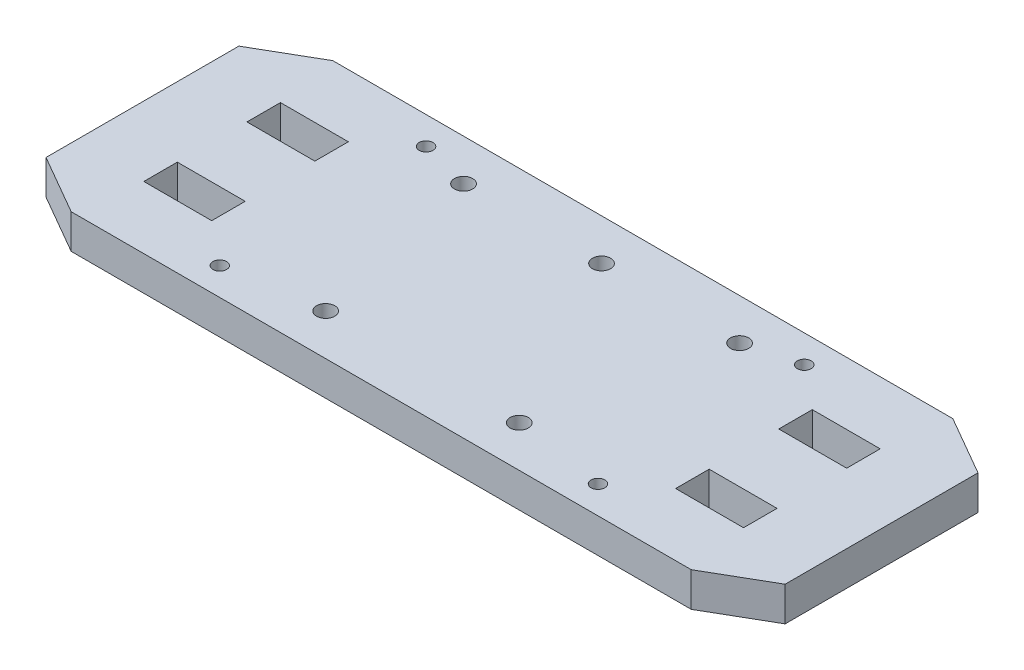
ISO-10303-21;
HEADER;
FILE_DESCRIPTION(('STEP AP214'),'2;1');
FILE_NAME('part.step','',(''),(''),'','','');
FILE_SCHEMA(('AUTOMOTIVE_DESIGN { 1 0 10303 214 1 1 1 1 }'));
ENDSEC;
DATA;
#1=APPLICATION_CONTEXT('core data for automotive mechanical design processes');
#2=APPLICATION_PROTOCOL_DEFINITION('international standard','automotive_design',2000,#1);
#3=PRODUCT_CONTEXT('',#1,'mechanical');
#4=PRODUCT('Part','Part','',(#3));
#5=PRODUCT_RELATED_PRODUCT_CATEGORY('part','',(#4));
#6=PRODUCT_DEFINITION_FORMATION('','',#4);
#7=PRODUCT_DEFINITION_CONTEXT('part definition',#1,'design');
#8=PRODUCT_DEFINITION('design','',#6,#7);
#9=PRODUCT_DEFINITION_SHAPE('','',#8);
#10=(LENGTH_UNIT() NAMED_UNIT(*) SI_UNIT(.MILLI.,.METRE.));
#11=(NAMED_UNIT(*) PLANE_ANGLE_UNIT() SI_UNIT($,.RADIAN.));
#12=(NAMED_UNIT(*) SI_UNIT($,.STERADIAN.) SOLID_ANGLE_UNIT());
#13=UNCERTAINTY_MEASURE_WITH_UNIT(LENGTH_MEASURE(1.E-05),#10,'distance_accuracy_value','');
#14=(GEOMETRIC_REPRESENTATION_CONTEXT(3) GLOBAL_UNCERTAINTY_ASSIGNED_CONTEXT((#13)) GLOBAL_UNIT_ASSIGNED_CONTEXT((#10,
#11,#12)) REPRESENTATION_CONTEXT('',''));
#15=CARTESIAN_POINT('',(0.,0.,0.));
#16=DIRECTION('',(0.,0.,1.));
#17=DIRECTION('',(1.,0.,0.));
#18=AXIS2_PLACEMENT_3D('',#15,#16,#17);
#19=CARTESIAN_POINT('',(0.,10.,0.));
#20=DIRECTION('',(0.,1.,0.));
#21=DIRECTION('',(0.,0.,1.));
#22=AXIS2_PLACEMENT_3D('',#19,#20,#21);
#23=PLANE('',#22);
#24=CARTESIAN_POINT('',(-55.,10.,-30.));
#25=DIRECTION('',(0.,1.,0.));
#26=DIRECTION('',(0.,0.,-1.));
#27=AXIS2_PLACEMENT_3D('',#24,#25,#26);
#28=CIRCLE('',#27,2.);
#29=CARTESIAN_POINT('',(-55.,10.,-32.));
#30=VERTEX_POINT('',#29);
#31=EDGE_CURVE('E839',#30,#30,#28,.T.);
#32=ORIENTED_EDGE('',*,*,#31,.F.);
#33=EDGE_LOOP('',(#32));
#34=FACE_BOUND('',#33,.T.);
#35=CARTESIAN_POINT('',(55.,10.,30.));
#36=DIRECTION('',(0.,1.,0.));
#37=DIRECTION('',(0.,0.,-1.));
#38=AXIS2_PLACEMENT_3D('',#35,#36,#37);
#39=CIRCLE('',#38,2.);
#40=CARTESIAN_POINT('',(55.,10.,28.));
#41=VERTEX_POINT('',#40);
#42=EDGE_CURVE('E844',#41,#41,#39,.T.);
#43=ORIENTED_EDGE('',*,*,#42,.F.);
#44=EDGE_LOOP('',(#43));
#45=FACE_BOUND('',#44,.T.);
#46=CARTESIAN_POINT('',(55.,10.,-30.));
#47=DIRECTION('',(0.,1.,0.));
#48=DIRECTION('',(0.,0.,1.));
#49=AXIS2_PLACEMENT_3D('',#46,#47,#48);
#50=CIRCLE('',#49,2.);
#51=CARTESIAN_POINT('',(55.,10.,-28.));
#52=VERTEX_POINT('',#51);
#53=EDGE_CURVE('E860',#52,#52,#50,.T.);
#54=ORIENTED_EDGE('',*,*,#53,.F.);
#55=EDGE_LOOP('',(#54));
#56=FACE_BOUND('',#55,.T.);
#57=CARTESIAN_POINT('',(-55.,10.,30.));
#58=DIRECTION('',(0.,1.,0.));
#59=DIRECTION('',(0.,0.,1.));
#60=AXIS2_PLACEMENT_3D('',#57,#58,#59);
#61=CIRCLE('',#60,2.);
#62=CARTESIAN_POINT('',(-55.,10.,32.));
#63=VERTEX_POINT('',#62);
#64=EDGE_CURVE('E225',#63,#63,#61,.T.);
#65=ORIENTED_EDGE('',*,*,#64,.F.);
#66=EDGE_LOOP('',(#65));
#67=FACE_BOUND('',#66,.T.);
#68=DIRECTION('',(0.,0.,-1.));
#69=VECTOR('',#68,1.);
#70=CARTESIAN_POINT('',(87.225,10.,19.875));
#71=LINE('',#70,#69);
#72=CARTESIAN_POINT('',(87.225,10.,19.875));
#73=VERTEX_POINT('',#72);
#74=CARTESIAN_POINT('',(87.225,10.,10.125));
#75=VERTEX_POINT('',#74);
#76=EDGE_CURVE('E288',#73,#75,#71,.T.);
#77=ORIENTED_EDGE('',*,*,#76,.F.);
#78=DIRECTION('',(1.,0.,0.));
#79=VECTOR('',#78,1.);
#80=CARTESIAN_POINT('',(87.225,10.,19.875));
#81=LINE('',#80,#79);
#82=CARTESIAN_POINT('',(67.475,10.,19.875));
#83=VERTEX_POINT('',#82);
#84=EDGE_CURVE('E278',#83,#73,#81,.T.);
#85=ORIENTED_EDGE('',*,*,#84,.F.);
#86=DIRECTION('',(0.,0.,1.));
#87=VECTOR('',#86,1.);
#88=CARTESIAN_POINT('',(67.475,10.,19.875));
#89=LINE('',#88,#87);
#90=CARTESIAN_POINT('',(67.475,10.,10.125));
#91=VERTEX_POINT('',#90);
#92=EDGE_CURVE('E294',#91,#83,#89,.T.);
#93=ORIENTED_EDGE('',*,*,#92,.F.);
#94=DIRECTION('',(-1.,0.,0.));
#95=VECTOR('',#94,1.);
#96=CARTESIAN_POINT('',(87.225,10.,10.125));
#97=LINE('',#96,#95);
#98=EDGE_CURVE('E290',#75,#91,#97,.T.);
#99=ORIENTED_EDGE('',*,*,#98,.F.);
#100=EDGE_LOOP('',(#77,#85,#93,#99));
#101=FACE_BOUND('',#100,.T.);
#102=DIRECTION('',(0.,0.,-1.));
#103=VECTOR('',#102,1.);
#104=CARTESIAN_POINT('',(87.225,10.,-19.875));
#105=LINE('',#104,#103);
#106=CARTESIAN_POINT('',(87.225,10.,-10.125));
#107=VERTEX_POINT('',#106);
#108=CARTESIAN_POINT('',(87.225,10.,-19.875));
#109=VERTEX_POINT('',#108);
#110=EDGE_CURVE('E256',#107,#109,#105,.T.);
#111=ORIENTED_EDGE('',*,*,#110,.F.);
#112=DIRECTION('',(1.,0.,0.));
#113=VECTOR('',#112,1.);
#114=CARTESIAN_POINT('',(87.225,10.,-10.125));
#115=LINE('',#114,#113);
#116=CARTESIAN_POINT('',(67.475,10.,-10.125));
#117=VERTEX_POINT('',#116);
#118=EDGE_CURVE('E246',#117,#107,#115,.T.);
#119=ORIENTED_EDGE('',*,*,#118,.F.);
#120=DIRECTION('',(0.,0.,1.));
#121=VECTOR('',#120,1.);
#122=CARTESIAN_POINT('',(67.475,10.,-19.875));
#123=LINE('',#122,#121);
#124=CARTESIAN_POINT('',(67.475,10.,-19.875));
#125=VERTEX_POINT('',#124);
#126=EDGE_CURVE('E262',#125,#117,#123,.T.);
#127=ORIENTED_EDGE('',*,*,#126,.F.);
#128=DIRECTION('',(-1.,0.,0.));
#129=VECTOR('',#128,1.);
#130=CARTESIAN_POINT('',(87.225,10.,-19.875));
#131=LINE('',#130,#129);
#132=EDGE_CURVE('E258',#109,#125,#131,.T.);
#133=ORIENTED_EDGE('',*,*,#132,.F.);
#134=EDGE_LOOP('',(#111,#119,#127,#133));
#135=FACE_BOUND('',#134,.T.);
#136=DIRECTION('',(0.,0.,1.));
#137=VECTOR('',#136,1.);
#138=CARTESIAN_POINT('',(-87.225,10.,-19.875));
#139=LINE('',#138,#137);
#140=CARTESIAN_POINT('',(-87.225,10.,-19.875));
#141=VERTEX_POINT('',#140);
#142=CARTESIAN_POINT('',(-87.225,10.,-10.125));
#143=VERTEX_POINT('',#142);
#144=EDGE_CURVE('E201',#141,#143,#139,.T.);
#145=ORIENTED_EDGE('',*,*,#144,.F.);
#146=DIRECTION('',(-1.,0.,0.));
#147=VECTOR('',#146,1.);
#148=CARTESIAN_POINT('',(-87.225,10.,-19.875));
#149=LINE('',#148,#147);
#150=CARTESIAN_POINT('',(-67.475,10.,-19.875));
#151=VERTEX_POINT('',#150);
#152=EDGE_CURVE('E219',#151,#141,#149,.T.);
#153=ORIENTED_EDGE('',*,*,#152,.F.);
#154=DIRECTION('',(0.,0.,-1.));
#155=VECTOR('',#154,1.);
#156=CARTESIAN_POINT('',(-67.475,10.,-19.875));
#157=LINE('',#156,#155);
#158=CARTESIAN_POINT('',(-67.475,10.,-10.125));
#159=VERTEX_POINT('',#158);
#160=EDGE_CURVE('E222',#159,#151,#157,.T.);
#161=ORIENTED_EDGE('',*,*,#160,.F.);
#162=DIRECTION('',(1.,0.,0.));
#163=VECTOR('',#162,1.);
#164=CARTESIAN_POINT('',(-87.225,10.,-10.125));
#165=LINE('',#164,#163);
#166=EDGE_CURVE('E231',#143,#159,#165,.T.);
#167=ORIENTED_EDGE('',*,*,#166,.F.);
#168=EDGE_LOOP('',(#145,#153,#161,#167));
#169=FACE_BOUND('',#168,.T.);
#170=DIRECTION('',(0.,0.,-1.));
#171=VECTOR('',#170,1.);
#172=CARTESIAN_POINT('',(-67.475,10.,19.875));
#173=LINE('',#172,#171);
#174=CARTESIAN_POINT('',(-67.475,10.,19.875));
#175=VERTEX_POINT('',#174);
#176=CARTESIAN_POINT('',(-67.475,10.,10.125));
#177=VERTEX_POINT('',#176);
#178=EDGE_CURVE('E238',#175,#177,#173,.T.);
#179=ORIENTED_EDGE('',*,*,#178,.F.);
#180=DIRECTION('',(1.,0.,0.));
#181=VECTOR('',#180,1.);
#182=CARTESIAN_POINT('',(-87.225,10.,19.875));
#183=LINE('',#182,#181);
#184=CARTESIAN_POINT('',(-87.225,10.,19.875));
#185=VERTEX_POINT('',#184);
#186=EDGE_CURVE('E310',#185,#175,#183,.T.);
#187=ORIENTED_EDGE('',*,*,#186,.F.);
#188=DIRECTION('',(0.,0.,1.));
#189=VECTOR('',#188,1.);
#190=CARTESIAN_POINT('',(-87.225,10.,19.875));
#191=LINE('',#190,#189);
#192=CARTESIAN_POINT('',(-87.225,10.,10.125));
#193=VERTEX_POINT('',#192);
#194=EDGE_CURVE('E324',#193,#185,#191,.T.);
#195=ORIENTED_EDGE('',*,*,#194,.F.);
#196=DIRECTION('',(-1.,0.,0.));
#197=VECTOR('',#196,1.);
#198=CARTESIAN_POINT('',(-87.225,10.,10.125));
#199=LINE('',#198,#197);
#200=EDGE_CURVE('E321',#177,#193,#199,.T.);
#201=ORIENTED_EDGE('',*,*,#200,.F.);
#202=EDGE_LOOP('',(#179,#187,#195,#201));
#203=FACE_BOUND('',#202,.T.);
#204=CARTESIAN_POINT('',(-28.15,10.,26.05));
#205=DIRECTION('',(0.,1.,0.));
#206=DIRECTION('',(0.,0.,1.));
#207=AXIS2_PLACEMENT_3D('',#204,#205,#206);
#208=CIRCLE('',#207,2.65);
#209=CARTESIAN_POINT('',(-28.15,10.,28.7));
#210=VERTEX_POINT('',#209);
#211=EDGE_CURVE('E344',#210,#210,#208,.T.);
#212=ORIENTED_EDGE('',*,*,#211,.F.);
#213=EDGE_LOOP('',(#212));
#214=FACE_BOUND('',#213,.T.);
#215=CARTESIAN_POINT('',(40.15,10.,-26.05));
#216=DIRECTION('',(0.,1.,0.));
#217=DIRECTION('',(0.,0.,-1.));
#218=AXIS2_PLACEMENT_3D('',#215,#216,#217);
#219=CIRCLE('',#218,2.65);
#220=CARTESIAN_POINT('',(40.15,10.,-28.7));
#221=VERTEX_POINT('',#220);
#222=EDGE_CURVE('E356',#221,#221,#219,.T.);
#223=ORIENTED_EDGE('',*,*,#222,.F.);
#224=EDGE_LOOP('',(#223));
#225=FACE_BOUND('',#224,.T.);
#226=DIRECTION('',(-1.,0.,0.));
#227=VECTOR('',#226,1.);
#228=CARTESIAN_POINT('',(107.5,10.,-38.05));
#229=LINE('',#228,#227);
#230=CARTESIAN_POINT('',(90.1794919243113,10.,-38.05));
#231=VERTEX_POINT('',#230);
#232=CARTESIAN_POINT('',(-90.1794919243113,10.,-38.05));
#233=VERTEX_POINT('',#232);
#234=EDGE_CURVE('E376',#231,#233,#229,.T.);
#235=ORIENTED_EDGE('',*,*,#234,.T.);
#236=DIRECTION('',(0.866025403784437,0.,-0.500000000000002));
#237=VECTOR('',#236,1.);
#238=CARTESIAN_POINT('',(-39.021006288077,10.,-67.5863654534136));
#239=LINE('',#238,#237);
#240=CARTESIAN_POINT('',(-107.5,10.,-28.05));
#241=VERTEX_POINT('',#240);
#242=EDGE_CURVE('E411',#233,#241,#239,.F.);
#243=ORIENTED_EDGE('',*,*,#242,.T.);
#244=DIRECTION('',(0.,0.,1.));
#245=VECTOR('',#244,1.);
#246=CARTESIAN_POINT('',(-107.5,10.,38.05));
#247=LINE('',#246,#245);
#248=CARTESIAN_POINT('',(-107.5,10.,28.05));
#249=VERTEX_POINT('',#248);
#250=EDGE_CURVE('E368',#241,#249,#247,.T.);
#251=ORIENTED_EDGE('',*,*,#250,.T.);
#252=DIRECTION('',(-0.866025403784438,0.,-0.5));
#253=VECTOR('',#252,1.);
#254=CARTESIAN_POINT('',(-39.0210062880768,10.,67.5863654534135));
#255=LINE('',#254,#253);
#256=CARTESIAN_POINT('',(-90.1794919243111,10.,38.05));
#257=VERTEX_POINT('',#256);
#258=EDGE_CURVE('E406',#249,#257,#255,.F.);
#259=ORIENTED_EDGE('',*,*,#258,.T.);
#260=DIRECTION('',(1.,0.,0.));
#261=VECTOR('',#260,1.);
#262=CARTESIAN_POINT('',(107.5,10.,38.05));
#263=LINE('',#262,#261);
#264=CARTESIAN_POINT('',(90.1794919243113,10.,38.05));
#265=VERTEX_POINT('',#264);
#266=EDGE_CURVE('E371',#257,#265,#263,.T.);
#267=ORIENTED_EDGE('',*,*,#266,.T.);
#268=DIRECTION('',(-0.866025403784438,0.,0.500000000000002));
#269=VECTOR('',#268,1.);
#270=CARTESIAN_POINT('',(39.021006288077,10.,67.5863654534136));
#271=LINE('',#270,#269);
#272=CARTESIAN_POINT('',(107.5,10.,28.05));
#273=VERTEX_POINT('',#272);
#274=EDGE_CURVE('E54',#265,#273,#271,.F.);
#275=ORIENTED_EDGE('',*,*,#274,.T.);
#276=DIRECTION('',(0.,0.,-1.));
#277=VECTOR('',#276,1.);
#278=CARTESIAN_POINT('',(107.5,10.,38.05));
#279=LINE('',#278,#277);
#280=CARTESIAN_POINT('',(107.5,10.,-28.05));
#281=VERTEX_POINT('',#280);
#282=EDGE_CURVE('E374',#273,#281,#279,.T.);
#283=ORIENTED_EDGE('',*,*,#282,.T.);
#284=DIRECTION('',(0.866025403784437,0.,0.500000000000002));
#285=VECTOR('',#284,1.);
#286=CARTESIAN_POINT('',(39.021006288077,10.,-67.5863654534137));
#287=LINE('',#286,#285);
#288=EDGE_CURVE('E408',#281,#231,#287,.F.);
#289=ORIENTED_EDGE('',*,*,#288,.T.);
#290=EDGE_LOOP('',(#235,#243,#251,#259,#267,#275,#283,#289));
#291=FACE_BOUND('',#290,.T.);
#292=CARTESIAN_POINT('',(-40.15,10.,-26.05));
#293=DIRECTION('',(0.,1.,0.));
#294=DIRECTION('',(0.,0.,1.));
#295=AXIS2_PLACEMENT_3D('',#292,#293,#294);
#296=CIRCLE('',#295,2.65);
#297=CARTESIAN_POINT('',(-40.15,10.,-23.4));
#298=VERTEX_POINT('',#297);
#299=EDGE_CURVE('E362',#298,#298,#296,.T.);
#300=ORIENTED_EDGE('',*,*,#299,.F.);
#301=EDGE_LOOP('',(#300));
#302=FACE_BOUND('',#301,.T.);
#303=CARTESIAN_POINT('',(0.,10.,-26.05));
#304=DIRECTION('',(0.,1.,0.));
#305=DIRECTION('',(0.,0.,1.));
#306=AXIS2_PLACEMENT_3D('',#303,#304,#305);
#307=CIRCLE('',#306,2.65);
#308=CARTESIAN_POINT('',(0.,10.,-23.4));
#309=VERTEX_POINT('',#308);
#310=EDGE_CURVE('E350',#309,#309,#307,.T.);
#311=ORIENTED_EDGE('',*,*,#310,.F.);
#312=EDGE_LOOP('',(#311));
#313=FACE_BOUND('',#312,.T.);
#314=CARTESIAN_POINT('',(28.15,10.,26.05));
#315=DIRECTION('',(0.,1.,0.));
#316=DIRECTION('',(0.,0.,-1.));
#317=AXIS2_PLACEMENT_3D('',#314,#315,#316);
#318=CIRCLE('',#317,2.65);
#319=CARTESIAN_POINT('',(28.15,10.,23.4));
#320=VERTEX_POINT('',#319);
#321=EDGE_CURVE('E338',#320,#320,#318,.T.);
#322=ORIENTED_EDGE('',*,*,#321,.F.);
#323=EDGE_LOOP('',(#322));
#324=FACE_BOUND('',#323,.T.);
#325=ADVANCED_FACE('F32',(#34,#45,#56,#67,#101,#135,#169,#203,#214,#225,#291,#302,#313,#324),
#23,.T.);
#326=CARTESIAN_POINT('',(0.,0.,0.));
#327=DIRECTION('',(0.,1.,0.));
#328=DIRECTION('',(0.,0.,1.));
#329=AXIS2_PLACEMENT_3D('',#326,#327,#328);
#330=PLANE('',#329);
#331=CARTESIAN_POINT('',(-55.,0.,-30.));
#332=DIRECTION('',(0.,1.,0.));
#333=DIRECTION('',(0.,0.,-1.));
#334=AXIS2_PLACEMENT_3D('',#331,#332,#333);
#335=CIRCLE('',#334,2.);
#336=CARTESIAN_POINT('',(-55.,0.,-32.));
#337=VERTEX_POINT('',#336);
#338=EDGE_CURVE('E837',#337,#337,#335,.T.);
#339=ORIENTED_EDGE('',*,*,#338,.T.);
#340=EDGE_LOOP('',(#339));
#341=FACE_BOUND('',#340,.T.);
#342=CARTESIAN_POINT('',(55.,0.,30.));
#343=DIRECTION('',(0.,1.,0.));
#344=DIRECTION('',(0.,0.,-1.));
#345=AXIS2_PLACEMENT_3D('',#342,#343,#344);
#346=CIRCLE('',#345,2.);
#347=CARTESIAN_POINT('',(55.,0.,28.));
#348=VERTEX_POINT('',#347);
#349=EDGE_CURVE('E840',#348,#348,#346,.T.);
#350=ORIENTED_EDGE('',*,*,#349,.T.);
#351=EDGE_LOOP('',(#350));
#352=FACE_BOUND('',#351,.T.);
#353=CARTESIAN_POINT('',(55.,0.,-30.));
#354=DIRECTION('',(0.,1.,0.));
#355=DIRECTION('',(0.,0.,1.));
#356=AXIS2_PLACEMENT_3D('',#353,#354,#355);
#357=CIRCLE('',#356,2.);
#358=CARTESIAN_POINT('',(55.,0.,-28.));
#359=VERTEX_POINT('',#358);
#360=EDGE_CURVE('E849',#359,#359,#357,.T.);
#361=ORIENTED_EDGE('',*,*,#360,.T.);
#362=EDGE_LOOP('',(#361));
#363=FACE_BOUND('',#362,.T.);
#364=CARTESIAN_POINT('',(-55.,0.,30.));
#365=DIRECTION('',(0.,1.,0.));
#366=DIRECTION('',(0.,0.,1.));
#367=AXIS2_PLACEMENT_3D('',#364,#365,#366);
#368=CIRCLE('',#367,2.);
#369=CARTESIAN_POINT('',(-55.,0.,32.));
#370=VERTEX_POINT('',#369);
#371=EDGE_CURVE('E291',#370,#370,#368,.T.);
#372=ORIENTED_EDGE('',*,*,#371,.T.);
#373=EDGE_LOOP('',(#372));
#374=FACE_BOUND('',#373,.T.);
#375=DIRECTION('',(1.,0.,0.));
#376=VECTOR('',#375,1.);
#377=CARTESIAN_POINT('',(87.225,0.,19.875));
#378=LINE('',#377,#376);
#379=CARTESIAN_POINT('',(67.475,0.,19.875));
#380=VERTEX_POINT('',#379);
#381=CARTESIAN_POINT('',(87.225,0.,19.875));
#382=VERTEX_POINT('',#381);
#383=EDGE_CURVE('E284',#380,#382,#378,.T.);
#384=ORIENTED_EDGE('',*,*,#383,.T.);
#385=DIRECTION('',(0.,0.,-1.));
#386=VECTOR('',#385,1.);
#387=CARTESIAN_POINT('',(87.225,0.,19.875));
#388=LINE('',#387,#386);
#389=CARTESIAN_POINT('',(87.225,0.,10.125));
#390=VERTEX_POINT('',#389);
#391=EDGE_CURVE('E274',#382,#390,#388,.T.);
#392=ORIENTED_EDGE('',*,*,#391,.T.);
#393=DIRECTION('',(-1.,0.,0.));
#394=VECTOR('',#393,1.);
#395=CARTESIAN_POINT('',(87.225,0.,10.125));
#396=LINE('',#395,#394);
#397=CARTESIAN_POINT('',(67.475,0.,10.125));
#398=VERTEX_POINT('',#397);
#399=EDGE_CURVE('E277',#390,#398,#396,.T.);
#400=ORIENTED_EDGE('',*,*,#399,.T.);
#401=DIRECTION('',(0.,0.,1.));
#402=VECTOR('',#401,1.);
#403=CARTESIAN_POINT('',(67.475,0.,19.875));
#404=LINE('',#403,#402);
#405=EDGE_CURVE('E281',#398,#380,#404,.T.);
#406=ORIENTED_EDGE('',*,*,#405,.T.);
#407=EDGE_LOOP('',(#384,#392,#400,#406));
#408=FACE_BOUND('',#407,.T.);
#409=DIRECTION('',(1.,0.,0.));
#410=VECTOR('',#409,1.);
#411=CARTESIAN_POINT('',(87.225,0.,-10.125));
#412=LINE('',#411,#410);
#413=CARTESIAN_POINT('',(67.475,0.,-10.125));
#414=VERTEX_POINT('',#413);
#415=CARTESIAN_POINT('',(87.225,0.,-10.125));
#416=VERTEX_POINT('',#415);
#417=EDGE_CURVE('E252',#414,#416,#412,.T.);
#418=ORIENTED_EDGE('',*,*,#417,.T.);
#419=DIRECTION('',(0.,0.,-1.));
#420=VECTOR('',#419,1.);
#421=CARTESIAN_POINT('',(87.225,0.,-19.875));
#422=LINE('',#421,#420);
#423=CARTESIAN_POINT('',(87.225,0.,-19.875));
#424=VERTEX_POINT('',#423);
#425=EDGE_CURVE('E242',#416,#424,#422,.T.);
#426=ORIENTED_EDGE('',*,*,#425,.T.);
#427=DIRECTION('',(-1.,0.,0.));
#428=VECTOR('',#427,1.);
#429=CARTESIAN_POINT('',(87.225,0.,-19.875));
#430=LINE('',#429,#428);
#431=CARTESIAN_POINT('',(67.475,0.,-19.875));
#432=VERTEX_POINT('',#431);
#433=EDGE_CURVE('E245',#424,#432,#430,.T.);
#434=ORIENTED_EDGE('',*,*,#433,.T.);
#435=DIRECTION('',(0.,0.,1.));
#436=VECTOR('',#435,1.);
#437=CARTESIAN_POINT('',(67.475,0.,-19.875));
#438=LINE('',#437,#436);
#439=EDGE_CURVE('E249',#432,#414,#438,.T.);
#440=ORIENTED_EDGE('',*,*,#439,.T.);
#441=EDGE_LOOP('',(#418,#426,#434,#440));
#442=FACE_BOUND('',#441,.T.);
#443=DIRECTION('',(-1.,0.,0.));
#444=VECTOR('',#443,1.);
#445=CARTESIAN_POINT('',(-87.225,0.,-19.875));
#446=LINE('',#445,#444);
#447=CARTESIAN_POINT('',(-67.475,0.,-19.875));
#448=VERTEX_POINT('',#447);
#449=CARTESIAN_POINT('',(-87.225,0.,-19.875));
#450=VERTEX_POINT('',#449);
#451=EDGE_CURVE('E206',#448,#450,#446,.T.);
#452=ORIENTED_EDGE('',*,*,#451,.T.);
#453=DIRECTION('',(0.,0.,1.));
#454=VECTOR('',#453,1.);
#455=CARTESIAN_POINT('',(-87.225,0.,-19.875));
#456=LINE('',#455,#454);
#457=CARTESIAN_POINT('',(-87.225,0.,-10.125));
#458=VERTEX_POINT('',#457);
#459=EDGE_CURVE('E198',#450,#458,#456,.T.);
#460=ORIENTED_EDGE('',*,*,#459,.T.);
#461=DIRECTION('',(1.,0.,0.));
#462=VECTOR('',#461,1.);
#463=CARTESIAN_POINT('',(-87.225,0.,-10.125));
#464=LINE('',#463,#462);
#465=CARTESIAN_POINT('',(-67.475,0.,-10.125));
#466=VERTEX_POINT('',#465);
#467=EDGE_CURVE('E210',#458,#466,#464,.T.);
#468=ORIENTED_EDGE('',*,*,#467,.T.);
#469=DIRECTION('',(0.,0.,-1.));
#470=VECTOR('',#469,1.);
#471=CARTESIAN_POINT('',(-67.475,0.,-19.875));
#472=LINE('',#471,#470);
#473=EDGE_CURVE('E214',#466,#448,#472,.T.);
#474=ORIENTED_EDGE('',*,*,#473,.T.);
#475=EDGE_LOOP('',(#452,#460,#468,#474));
#476=FACE_BOUND('',#475,.T.);
#477=DIRECTION('',(1.,0.,0.));
#478=VECTOR('',#477,1.);
#479=CARTESIAN_POINT('',(-87.225,0.,19.875));
#480=LINE('',#479,#478);
#481=CARTESIAN_POINT('',(-87.225,0.,19.875));
#482=VERTEX_POINT('',#481);
#483=CARTESIAN_POINT('',(-67.475,0.,19.875));
#484=VERTEX_POINT('',#483);
#485=EDGE_CURVE('E316',#482,#484,#480,.T.);
#486=ORIENTED_EDGE('',*,*,#485,.T.);
#487=DIRECTION('',(0.,0.,-1.));
#488=VECTOR('',#487,1.);
#489=CARTESIAN_POINT('',(-67.475,0.,19.875));
#490=LINE('',#489,#488);
#491=CARTESIAN_POINT('',(-67.475,0.,10.125));
#492=VERTEX_POINT('',#491);
#493=EDGE_CURVE('E306',#484,#492,#490,.T.);
#494=ORIENTED_EDGE('',*,*,#493,.T.);
#495=DIRECTION('',(-1.,0.,0.));
#496=VECTOR('',#495,1.);
#497=CARTESIAN_POINT('',(-87.225,0.,10.125));
#498=LINE('',#497,#496);
#499=CARTESIAN_POINT('',(-87.225,0.,10.125));
#500=VERTEX_POINT('',#499);
#501=EDGE_CURVE('E309',#492,#500,#498,.T.);
#502=ORIENTED_EDGE('',*,*,#501,.T.);
#503=DIRECTION('',(0.,0.,1.));
#504=VECTOR('',#503,1.);
#505=CARTESIAN_POINT('',(-87.225,0.,19.875));
#506=LINE('',#505,#504);
#507=EDGE_CURVE('E313',#500,#482,#506,.T.);
#508=ORIENTED_EDGE('',*,*,#507,.T.);
#509=EDGE_LOOP('',(#486,#494,#502,#508));
#510=FACE_BOUND('',#509,.T.);
#511=DIRECTION('',(0.,0.,1.));
#512=VECTOR('',#511,1.);
#513=CARTESIAN_POINT('',(-107.5,0.,38.05));
#514=LINE('',#513,#512);
#515=CARTESIAN_POINT('',(-107.5,0.,-28.05));
#516=VERTEX_POINT('',#515);
#517=CARTESIAN_POINT('',(-107.5,0.,28.05));
#518=VERTEX_POINT('',#517);
#519=EDGE_CURVE('E365',#516,#518,#514,.T.);
#520=ORIENTED_EDGE('',*,*,#519,.F.);
#521=DIRECTION('',(-0.866025403784437,0.,0.500000000000002));
#522=VECTOR('',#521,1.);
#523=CARTESIAN_POINT('',(-107.5,0.,-28.05));
#524=LINE('',#523,#522);
#525=CARTESIAN_POINT('',(-90.1794919243113,0.,-38.05));
#526=VERTEX_POINT('',#525);
#527=EDGE_CURVE('E399',#516,#526,#524,.F.);
#528=ORIENTED_EDGE('',*,*,#527,.T.);
#529=DIRECTION('',(-1.,0.,0.));
#530=VECTOR('',#529,1.);
#531=CARTESIAN_POINT('',(107.5,0.,-38.05));
#532=LINE('',#531,#530);
#533=CARTESIAN_POINT('',(90.1794919243113,0.,-38.05));
#534=VERTEX_POINT('',#533);
#535=EDGE_CURVE('E372',#534,#526,#532,.T.);
#536=ORIENTED_EDGE('',*,*,#535,.F.);
#537=DIRECTION('',(-0.866025403784437,0.,-0.500000000000002));
#538=VECTOR('',#537,1.);
#539=CARTESIAN_POINT('',(90.1794919243113,0.,-38.05));
#540=LINE('',#539,#538);
#541=CARTESIAN_POINT('',(107.5,0.,-28.05));
#542=VERTEX_POINT('',#541);
#543=EDGE_CURVE('E395',#534,#542,#540,.F.);
#544=ORIENTED_EDGE('',*,*,#543,.T.);
#545=DIRECTION('',(0.,0.,-1.));
#546=VECTOR('',#545,1.);
#547=CARTESIAN_POINT('',(107.5,0.,38.05));
#548=LINE('',#547,#546);
#549=CARTESIAN_POINT('',(107.5,0.,28.05));
#550=VERTEX_POINT('',#549);
#551=EDGE_CURVE('E385',#550,#542,#548,.T.);
#552=ORIENTED_EDGE('',*,*,#551,.F.);
#553=DIRECTION('',(0.866025403784438,0.,-0.500000000000002));
#554=VECTOR('',#553,1.);
#555=CARTESIAN_POINT('',(107.5,0.,28.05));
#556=LINE('',#555,#554);
#557=CARTESIAN_POINT('',(90.1794919243113,0.,38.05));
#558=VERTEX_POINT('',#557);
#559=EDGE_CURVE('E397',#550,#558,#556,.F.);
#560=ORIENTED_EDGE('',*,*,#559,.T.);
#561=DIRECTION('',(1.,0.,0.));
#562=VECTOR('',#561,1.);
#563=CARTESIAN_POINT('',(107.5,0.,38.05));
#564=LINE('',#563,#562);
#565=CARTESIAN_POINT('',(-90.1794919243111,0.,38.05));
#566=VERTEX_POINT('',#565);
#567=EDGE_CURVE('E382',#566,#558,#564,.T.);
#568=ORIENTED_EDGE('',*,*,#567,.F.);
#569=DIRECTION('',(0.866025403784438,0.,0.5));
#570=VECTOR('',#569,1.);
#571=CARTESIAN_POINT('',(-90.1794919243112,0.,38.05));
#572=LINE('',#571,#570);
#573=EDGE_CURVE('E393',#566,#518,#572,.F.);
#574=ORIENTED_EDGE('',*,*,#573,.T.);
#575=EDGE_LOOP('',(#520,#528,#536,#544,#552,#560,#568,#574));
#576=FACE_BOUND('',#575,.T.);
#577=CARTESIAN_POINT('',(-40.15,0.,-26.05));
#578=DIRECTION('',(0.,1.,0.));
#579=DIRECTION('',(0.,0.,1.));
#580=AXIS2_PLACEMENT_3D('',#577,#578,#579);
#581=CIRCLE('',#580,2.65);
#582=CARTESIAN_POINT('',(-40.15,0.,-23.4));
#583=VERTEX_POINT('',#582);
#584=EDGE_CURVE('E359',#583,#583,#581,.T.);
#585=ORIENTED_EDGE('',*,*,#584,.T.);
#586=EDGE_LOOP('',(#585));
#587=FACE_BOUND('',#586,.T.);
#588=CARTESIAN_POINT('',(40.15,0.,-26.05));
#589=DIRECTION('',(0.,1.,0.));
#590=DIRECTION('',(0.,0.,-1.));
#591=AXIS2_PLACEMENT_3D('',#588,#589,#590);
#592=CIRCLE('',#591,2.65);
#593=CARTESIAN_POINT('',(40.15,0.,-28.7));
#594=VERTEX_POINT('',#593);
#595=EDGE_CURVE('E353',#594,#594,#592,.T.);
#596=ORIENTED_EDGE('',*,*,#595,.T.);
#597=EDGE_LOOP('',(#596));
#598=FACE_BOUND('',#597,.T.);
#599=CARTESIAN_POINT('',(0.,0.,-26.05));
#600=DIRECTION('',(0.,1.,0.));
#601=DIRECTION('',(0.,0.,1.));
#602=AXIS2_PLACEMENT_3D('',#599,#600,#601);
#603=CIRCLE('',#602,2.65);
#604=CARTESIAN_POINT('',(0.,0.,-23.4));
#605=VERTEX_POINT('',#604);
#606=EDGE_CURVE('E347',#605,#605,#603,.T.);
#607=ORIENTED_EDGE('',*,*,#606,.T.);
#608=EDGE_LOOP('',(#607));
#609=FACE_BOUND('',#608,.T.);
#610=CARTESIAN_POINT('',(-28.15,0.,26.05));
#611=DIRECTION('',(0.,1.,0.));
#612=DIRECTION('',(0.,0.,1.));
#613=AXIS2_PLACEMENT_3D('',#610,#611,#612);
#614=CIRCLE('',#613,2.65);
#615=CARTESIAN_POINT('',(-28.15,0.,28.7));
#616=VERTEX_POINT('',#615);
#617=EDGE_CURVE('E341',#616,#616,#614,.T.);
#618=ORIENTED_EDGE('',*,*,#617,.T.);
#619=EDGE_LOOP('',(#618));
#620=FACE_BOUND('',#619,.T.);
#621=CARTESIAN_POINT('',(28.15,0.,26.05));
#622=DIRECTION('',(0.,1.,0.));
#623=DIRECTION('',(0.,0.,-1.));
#624=AXIS2_PLACEMENT_3D('',#621,#622,#623);
#625=CIRCLE('',#624,2.65);
#626=CARTESIAN_POINT('',(28.15,0.,23.4));
#627=VERTEX_POINT('',#626);
#628=EDGE_CURVE('E331',#627,#627,#625,.T.);
#629=ORIENTED_EDGE('',*,*,#628,.T.);
#630=EDGE_LOOP('',(#629));
#631=FACE_BOUND('',#630,.T.);
#632=ADVANCED_FACE('F216',(#341,#352,#363,#374,#408,#442,#476,#510,#576,#587,#598,#609,#620,
#631),#330,.F.);
#633=CARTESIAN_POINT('',(-107.5,10.,38.05));
#634=DIRECTION('',(1.,0.,0.));
#635=DIRECTION('',(0.,0.,-1.));
#636=AXIS2_PLACEMENT_3D('',#633,#634,#635);
#637=PLANE('',#636);
#638=ORIENTED_EDGE('',*,*,#250,.F.);
#639=DIRECTION('',(0.,-1.,0.));
#640=VECTOR('',#639,1.);
#641=CARTESIAN_POINT('',(-107.5,10.,-28.05));
#642=LINE('',#641,#640);
#643=EDGE_CURVE('E390',#241,#516,#642,.T.);
#644=ORIENTED_EDGE('',*,*,#643,.T.);
#645=ORIENTED_EDGE('',*,*,#519,.T.);
#646=DIRECTION('',(0.,1.,0.));
#647=VECTOR('',#646,1.);
#648=CARTESIAN_POINT('',(-107.5,10.,28.05));
#649=LINE('',#648,#647);
#650=EDGE_CURVE('E379',#518,#249,#649,.T.);
#651=ORIENTED_EDGE('',*,*,#650,.T.);
#652=EDGE_LOOP('',(#638,#644,#645,#651));
#653=FACE_BOUND('',#652,.T.);
#654=ADVANCED_FACE('F449',(#653),#637,.F.);
#655=CARTESIAN_POINT('',(107.5,10.,38.05));
#656=DIRECTION('',(0.,0.,-1.));
#657=DIRECTION('',(-1.,0.,0.));
#658=AXIS2_PLACEMENT_3D('',#655,#656,#657);
#659=PLANE('',#658);
#660=ORIENTED_EDGE('',*,*,#567,.T.);
#661=DIRECTION('',(0.,1.,0.));
#662=VECTOR('',#661,1.);
#663=CARTESIAN_POINT('',(90.1794919243113,10.,38.05));
#664=LINE('',#663,#662);
#665=EDGE_CURVE('E11',#558,#265,#664,.T.);
#666=ORIENTED_EDGE('',*,*,#665,.T.);
#667=ORIENTED_EDGE('',*,*,#266,.F.);
#668=DIRECTION('',(0.,-1.,0.));
#669=VECTOR('',#668,1.);
#670=CARTESIAN_POINT('',(-90.1794919243112,10.,38.05));
#671=LINE('',#670,#669);
#672=EDGE_CURVE('E40',#257,#566,#671,.T.);
#673=ORIENTED_EDGE('',*,*,#672,.T.);
#674=EDGE_LOOP('',(#660,#666,#667,#673));
#675=FACE_BOUND('',#674,.T.);
#676=ADVANCED_FACE('F421',(#675),#659,.F.);
#677=CARTESIAN_POINT('',(107.5,10.,38.05));
#678=DIRECTION('',(-1.,0.,0.));
#679=DIRECTION('',(0.,0.,1.));
#680=AXIS2_PLACEMENT_3D('',#677,#678,#679);
#681=PLANE('',#680);
#682=ORIENTED_EDGE('',*,*,#282,.F.);
#683=DIRECTION('',(0.,-1.,0.));
#684=VECTOR('',#683,1.);
#685=CARTESIAN_POINT('',(107.5,10.,28.05));
#686=LINE('',#685,#684);
#687=EDGE_CURVE('E414',#273,#550,#686,.T.);
#688=ORIENTED_EDGE('',*,*,#687,.T.);
#689=ORIENTED_EDGE('',*,*,#551,.T.);
#690=DIRECTION('',(0.,1.,0.));
#691=VECTOR('',#690,1.);
#692=CARTESIAN_POINT('',(107.5,10.,-28.05));
#693=LINE('',#692,#691);
#694=EDGE_CURVE('E47',#542,#281,#693,.T.);
#695=ORIENTED_EDGE('',*,*,#694,.T.);
#696=EDGE_LOOP('',(#682,#688,#689,#695));
#697=FACE_BOUND('',#696,.T.);
#698=ADVANCED_FACE('F432',(#697),#681,.F.);
#699=CARTESIAN_POINT('',(107.5,10.,-38.05));
#700=DIRECTION('',(0.,0.,1.));
#701=DIRECTION('',(1.,0.,0.));
#702=AXIS2_PLACEMENT_3D('',#699,#700,#701);
#703=PLANE('',#702);
#704=ORIENTED_EDGE('',*,*,#535,.T.);
#705=DIRECTION('',(0.,1.,0.));
#706=VECTOR('',#705,1.);
#707=CARTESIAN_POINT('',(-90.1794919243113,10.,-38.05));
#708=LINE('',#707,#706);
#709=EDGE_CURVE('E404',#526,#233,#708,.T.);
#710=ORIENTED_EDGE('',*,*,#709,.T.);
#711=ORIENTED_EDGE('',*,*,#234,.F.);
#712=DIRECTION('',(0.,-1.,0.));
#713=VECTOR('',#712,1.);
#714=CARTESIAN_POINT('',(90.1794919243113,10.,-38.05));
#715=LINE('',#714,#713);
#716=EDGE_CURVE('E401',#231,#534,#715,.T.);
#717=ORIENTED_EDGE('',*,*,#716,.T.);
#718=EDGE_LOOP('',(#704,#710,#711,#717));
#719=FACE_BOUND('',#718,.T.);
#720=ADVANCED_FACE('F441',(#719),#703,.F.);
#721=CARTESIAN_POINT('',(-40.15,10.,-26.05));
#722=DIRECTION('',(0.,-1.,0.));
#723=DIRECTION('',(0.,0.,-1.));
#724=AXIS2_PLACEMENT_3D('',#721,#722,#723);
#725=CYLINDRICAL_SURFACE('',#724,2.65);
#726=ORIENTED_EDGE('',*,*,#299,.T.);
#727=EDGE_LOOP('',(#726));
#728=FACE_BOUND('',#727,.T.);
#729=ORIENTED_EDGE('',*,*,#584,.F.);
#730=EDGE_LOOP('',(#729));
#731=FACE_BOUND('',#730,.T.);
#732=ADVANCED_FACE('F471',(#728,#731),#725,.F.);
#733=CARTESIAN_POINT('',(40.15,10.,-26.05));
#734=DIRECTION('',(0.,-1.,0.));
#735=DIRECTION('',(0.,0.,-1.));
#736=AXIS2_PLACEMENT_3D('',#733,#734,#735);
#737=CYLINDRICAL_SURFACE('',#736,2.65);
#738=ORIENTED_EDGE('',*,*,#222,.T.);
#739=EDGE_LOOP('',(#738));
#740=FACE_BOUND('',#739,.T.);
#741=ORIENTED_EDGE('',*,*,#595,.F.);
#742=EDGE_LOOP('',(#741));
#743=FACE_BOUND('',#742,.T.);
#744=ADVANCED_FACE('F620',(#740,#743),#737,.F.);
#745=CARTESIAN_POINT('',(0.,10.,-26.05));
#746=DIRECTION('',(0.,-1.,0.));
#747=DIRECTION('',(0.,0.,-1.));
#748=AXIS2_PLACEMENT_3D('',#745,#746,#747);
#749=CYLINDRICAL_SURFACE('',#748,2.65);
#750=ORIENTED_EDGE('',*,*,#310,.T.);
#751=EDGE_LOOP('',(#750));
#752=FACE_BOUND('',#751,.T.);
#753=ORIENTED_EDGE('',*,*,#606,.F.);
#754=EDGE_LOOP('',(#753));
#755=FACE_BOUND('',#754,.T.);
#756=ADVANCED_FACE('F617',(#752,#755),#749,.F.);
#757=CARTESIAN_POINT('',(-28.15,10.,26.05));
#758=DIRECTION('',(0.,-1.,0.));
#759=DIRECTION('',(0.,0.,-1.));
#760=AXIS2_PLACEMENT_3D('',#757,#758,#759);
#761=CYLINDRICAL_SURFACE('',#760,2.65);
#762=ORIENTED_EDGE('',*,*,#211,.T.);
#763=EDGE_LOOP('',(#762));
#764=FACE_BOUND('',#763,.T.);
#765=ORIENTED_EDGE('',*,*,#617,.F.);
#766=EDGE_LOOP('',(#765));
#767=FACE_BOUND('',#766,.T.);
#768=ADVANCED_FACE('F613',(#764,#767),#761,.F.);
#769=CARTESIAN_POINT('',(28.15,10.,26.05));
#770=DIRECTION('',(0.,-1.,0.));
#771=DIRECTION('',(0.,0.,-1.));
#772=AXIS2_PLACEMENT_3D('',#769,#770,#771);
#773=CYLINDRICAL_SURFACE('',#772,2.65);
#774=ORIENTED_EDGE('',*,*,#321,.T.);
#775=EDGE_LOOP('',(#774));
#776=FACE_BOUND('',#775,.T.);
#777=ORIENTED_EDGE('',*,*,#628,.F.);
#778=EDGE_LOOP('',(#777));
#779=FACE_BOUND('',#778,.T.);
#780=ADVANCED_FACE('F609',(#776,#779),#773,.F.);
#781=CARTESIAN_POINT('',(-67.475,0.,19.875));
#782=DIRECTION('',(1.,0.,0.));
#783=DIRECTION('',(0.,0.,-1.));
#784=AXIS2_PLACEMENT_3D('',#781,#782,#783);
#785=PLANE('',#784);
#786=ORIENTED_EDGE('',*,*,#178,.T.);
#787=DIRECTION('',(0.,1.,0.));
#788=VECTOR('',#787,1.);
#789=CARTESIAN_POINT('',(-67.475,0.,10.125));
#790=LINE('',#789,#788);
#791=EDGE_CURVE('E319',#492,#177,#790,.T.);
#792=ORIENTED_EDGE('',*,*,#791,.F.);
#793=ORIENTED_EDGE('',*,*,#493,.F.);
#794=DIRECTION('',(0.,1.,0.));
#795=VECTOR('',#794,1.);
#796=CARTESIAN_POINT('',(-67.475,0.,19.875));
#797=LINE('',#796,#795);
#798=EDGE_CURVE('E329',#484,#175,#797,.T.);
#799=ORIENTED_EDGE('',*,*,#798,.T.);
#800=EDGE_LOOP('',(#786,#792,#793,#799));
#801=FACE_BOUND('',#800,.T.);
#802=ADVANCED_FACE('F599',(#801),#785,.F.);
#803=CARTESIAN_POINT('',(-87.225,0.,19.875));
#804=DIRECTION('',(0.,0.,1.));
#805=DIRECTION('',(1.,0.,0.));
#806=AXIS2_PLACEMENT_3D('',#803,#804,#805);
#807=PLANE('',#806);
#808=ORIENTED_EDGE('',*,*,#186,.T.);
#809=ORIENTED_EDGE('',*,*,#798,.F.);
#810=ORIENTED_EDGE('',*,*,#485,.F.);
#811=DIRECTION('',(0.,1.,0.));
#812=VECTOR('',#811,1.);
#813=CARTESIAN_POINT('',(-87.225,0.,19.875));
#814=LINE('',#813,#812);
#815=EDGE_CURVE('E332',#482,#185,#814,.T.);
#816=ORIENTED_EDGE('',*,*,#815,.T.);
#817=EDGE_LOOP('',(#808,#809,#810,#816));
#818=FACE_BOUND('',#817,.T.);
#819=ADVANCED_FACE('F595',(#818),#807,.F.);
#820=CARTESIAN_POINT('',(-87.225,0.,19.875));
#821=DIRECTION('',(-1.,0.,0.));
#822=DIRECTION('',(0.,0.,1.));
#823=AXIS2_PLACEMENT_3D('',#820,#821,#822);
#824=PLANE('',#823);
#825=ORIENTED_EDGE('',*,*,#194,.T.);
#826=ORIENTED_EDGE('',*,*,#815,.F.);
#827=ORIENTED_EDGE('',*,*,#507,.F.);
#828=DIRECTION('',(0.,1.,0.));
#829=VECTOR('',#828,1.);
#830=CARTESIAN_POINT('',(-87.225,0.,10.125));
#831=LINE('',#830,#829);
#832=EDGE_CURVE('E334',#500,#193,#831,.T.);
#833=ORIENTED_EDGE('',*,*,#832,.T.);
#834=EDGE_LOOP('',(#825,#826,#827,#833));
#835=FACE_BOUND('',#834,.T.);
#836=ADVANCED_FACE('F598',(#835),#824,.F.);
#837=CARTESIAN_POINT('',(-87.225,0.,10.125));
#838=DIRECTION('',(0.,0.,-1.));
#839=DIRECTION('',(-1.,0.,0.));
#840=AXIS2_PLACEMENT_3D('',#837,#838,#839);
#841=PLANE('',#840);
#842=ORIENTED_EDGE('',*,*,#200,.T.);
#843=ORIENTED_EDGE('',*,*,#832,.F.);
#844=ORIENTED_EDGE('',*,*,#501,.F.);
#845=ORIENTED_EDGE('',*,*,#791,.T.);
#846=EDGE_LOOP('',(#842,#843,#844,#845));
#847=FACE_BOUND('',#846,.T.);
#848=ADVANCED_FACE('F565',(#847),#841,.F.);
#849=CARTESIAN_POINT('',(-87.225,0.,-19.875));
#850=DIRECTION('',(-1.,0.,0.));
#851=DIRECTION('',(0.,0.,1.));
#852=AXIS2_PLACEMENT_3D('',#849,#850,#851);
#853=PLANE('',#852);
#854=ORIENTED_EDGE('',*,*,#144,.T.);
#855=DIRECTION('',(0.,1.,0.));
#856=VECTOR('',#855,1.);
#857=CARTESIAN_POINT('',(-87.225,0.,-10.125));
#858=LINE('',#857,#856);
#859=EDGE_CURVE('E194',#458,#143,#858,.T.);
#860=ORIENTED_EDGE('',*,*,#859,.F.);
#861=ORIENTED_EDGE('',*,*,#459,.F.);
#862=DIRECTION('',(0.,1.,0.));
#863=VECTOR('',#862,1.);
#864=CARTESIAN_POINT('',(-87.225,0.,-19.875));
#865=LINE('',#864,#863);
#866=EDGE_CURVE('E236',#450,#141,#865,.T.);
#867=ORIENTED_EDGE('',*,*,#866,.T.);
#868=EDGE_LOOP('',(#854,#860,#861,#867));
#869=FACE_BOUND('',#868,.T.);
#870=ADVANCED_FACE('F196',(#869),#853,.F.);
#871=CARTESIAN_POINT('',(-87.225,0.,-19.875));
#872=DIRECTION('',(0.,0.,-1.));
#873=DIRECTION('',(-1.,0.,0.));
#874=AXIS2_PLACEMENT_3D('',#871,#872,#873);
#875=PLANE('',#874);
#876=ORIENTED_EDGE('',*,*,#152,.T.);
#877=ORIENTED_EDGE('',*,*,#866,.F.);
#878=ORIENTED_EDGE('',*,*,#451,.F.);
#879=DIRECTION('',(0.,1.,0.));
#880=VECTOR('',#879,1.);
#881=CARTESIAN_POINT('',(-67.475,0.,-19.875));
#882=LINE('',#881,#880);
#883=EDGE_CURVE('E239',#448,#151,#882,.T.);
#884=ORIENTED_EDGE('',*,*,#883,.T.);
#885=EDGE_LOOP('',(#876,#877,#878,#884));
#886=FACE_BOUND('',#885,.T.);
#887=ADVANCED_FACE('F552',(#886),#875,.F.);
#888=CARTESIAN_POINT('',(-67.475,0.,-19.875));
#889=DIRECTION('',(1.,0.,0.));
#890=DIRECTION('',(0.,0.,-1.));
#891=AXIS2_PLACEMENT_3D('',#888,#889,#890);
#892=PLANE('',#891);
#893=ORIENTED_EDGE('',*,*,#160,.T.);
#894=ORIENTED_EDGE('',*,*,#883,.F.);
#895=ORIENTED_EDGE('',*,*,#473,.F.);
#896=DIRECTION('',(0.,1.,0.));
#897=VECTOR('',#896,1.);
#898=CARTESIAN_POINT('',(-67.475,0.,-10.125));
#899=LINE('',#898,#897);
#900=EDGE_CURVE('E205',#466,#159,#899,.T.);
#901=ORIENTED_EDGE('',*,*,#900,.T.);
#902=EDGE_LOOP('',(#893,#894,#895,#901));
#903=FACE_BOUND('',#902,.T.);
#904=ADVANCED_FACE('F555',(#903),#892,.F.);
#905=CARTESIAN_POINT('',(-87.225,0.,-10.125));
#906=DIRECTION('',(0.,0.,1.));
#907=DIRECTION('',(1.,0.,0.));
#908=AXIS2_PLACEMENT_3D('',#905,#906,#907);
#909=PLANE('',#908);
#910=ORIENTED_EDGE('',*,*,#166,.T.);
#911=ORIENTED_EDGE('',*,*,#900,.F.);
#912=ORIENTED_EDGE('',*,*,#467,.F.);
#913=ORIENTED_EDGE('',*,*,#859,.T.);
#914=EDGE_LOOP('',(#910,#911,#912,#913));
#915=FACE_BOUND('',#914,.T.);
#916=ADVANCED_FACE('F211',(#915),#909,.F.);
#917=CARTESIAN_POINT('',(87.225,0.,-19.875));
#918=DIRECTION('',(1.,0.,0.));
#919=DIRECTION('',(0.,0.,-1.));
#920=AXIS2_PLACEMENT_3D('',#917,#918,#919);
#921=PLANE('',#920);
#922=ORIENTED_EDGE('',*,*,#110,.T.);
#923=DIRECTION('',(0.,1.,0.));
#924=VECTOR('',#923,1.);
#925=CARTESIAN_POINT('',(87.225,0.,-19.875));
#926=LINE('',#925,#924);
#927=EDGE_CURVE('E255',#424,#109,#926,.T.);
#928=ORIENTED_EDGE('',*,*,#927,.F.);
#929=ORIENTED_EDGE('',*,*,#425,.F.);
#930=DIRECTION('',(0.,1.,0.));
#931=VECTOR('',#930,1.);
#932=CARTESIAN_POINT('',(87.225,0.,-10.125));
#933=LINE('',#932,#931);
#934=EDGE_CURVE('E232',#416,#107,#933,.T.);
#935=ORIENTED_EDGE('',*,*,#934,.T.);
#936=EDGE_LOOP('',(#922,#928,#929,#935));
#937=FACE_BOUND('',#936,.T.);
#938=ADVANCED_FACE('F562',(#937),#921,.F.);
#939=CARTESIAN_POINT('',(87.225,0.,-10.125));
#940=DIRECTION('',(0.,0.,1.));
#941=DIRECTION('',(1.,0.,0.));
#942=AXIS2_PLACEMENT_3D('',#939,#940,#941);
#943=PLANE('',#942);
#944=ORIENTED_EDGE('',*,*,#118,.T.);
#945=ORIENTED_EDGE('',*,*,#934,.F.);
#946=ORIENTED_EDGE('',*,*,#417,.F.);
#947=DIRECTION('',(0.,1.,0.));
#948=VECTOR('',#947,1.);
#949=CARTESIAN_POINT('',(67.475,0.,-10.125));
#950=LINE('',#949,#948);
#951=EDGE_CURVE('E268',#414,#117,#950,.T.);
#952=ORIENTED_EDGE('',*,*,#951,.T.);
#953=EDGE_LOOP('',(#944,#945,#946,#952));
#954=FACE_BOUND('',#953,.T.);
#955=ADVANCED_FACE('F566',(#954),#943,.F.);
#956=CARTESIAN_POINT('',(67.475,0.,-19.875));
#957=DIRECTION('',(-1.,0.,0.));
#958=DIRECTION('',(0.,0.,1.));
#959=AXIS2_PLACEMENT_3D('',#956,#957,#958);
#960=PLANE('',#959);
#961=ORIENTED_EDGE('',*,*,#126,.T.);
#962=ORIENTED_EDGE('',*,*,#951,.F.);
#963=ORIENTED_EDGE('',*,*,#439,.F.);
#964=DIRECTION('',(0.,1.,0.));
#965=VECTOR('',#964,1.);
#966=CARTESIAN_POINT('',(67.475,0.,-19.875));
#967=LINE('',#966,#965);
#968=EDGE_CURVE('E270',#432,#125,#967,.T.);
#969=ORIENTED_EDGE('',*,*,#968,.T.);
#970=EDGE_LOOP('',(#961,#962,#963,#969));
#971=FACE_BOUND('',#970,.T.);
#972=ADVANCED_FACE('F569',(#971),#960,.F.);
#973=CARTESIAN_POINT('',(87.225,0.,-19.875));
#974=DIRECTION('',(0.,0.,-1.));
#975=DIRECTION('',(-1.,0.,0.));
#976=AXIS2_PLACEMENT_3D('',#973,#974,#975);
#977=PLANE('',#976);
#978=ORIENTED_EDGE('',*,*,#132,.T.);
#979=ORIENTED_EDGE('',*,*,#968,.F.);
#980=ORIENTED_EDGE('',*,*,#433,.F.);
#981=ORIENTED_EDGE('',*,*,#927,.T.);
#982=EDGE_LOOP('',(#978,#979,#980,#981));
#983=FACE_BOUND('',#982,.T.);
#984=ADVANCED_FACE('F573',(#983),#977,.F.);
#985=CARTESIAN_POINT('',(87.225,0.,19.875));
#986=DIRECTION('',(1.,0.,0.));
#987=DIRECTION('',(0.,0.,-1.));
#988=AXIS2_PLACEMENT_3D('',#985,#986,#987);
#989=PLANE('',#988);
#990=ORIENTED_EDGE('',*,*,#76,.T.);
#991=DIRECTION('',(0.,1.,0.));
#992=VECTOR('',#991,1.);
#993=CARTESIAN_POINT('',(87.225,0.,10.125));
#994=LINE('',#993,#992);
#995=EDGE_CURVE('E287',#390,#75,#994,.T.);
#996=ORIENTED_EDGE('',*,*,#995,.F.);
#997=ORIENTED_EDGE('',*,*,#391,.F.);
#998=DIRECTION('',(0.,1.,0.));
#999=VECTOR('',#998,1.);
#1000=CARTESIAN_POINT('',(87.225,0.,19.875));
#1001=LINE('',#1000,#999);
#1002=EDGE_CURVE('E259',#382,#73,#1001,.T.);
#1003=ORIENTED_EDGE('',*,*,#1002,.T.);
#1004=EDGE_LOOP('',(#990,#996,#997,#1003));
#1005=FACE_BOUND('',#1004,.T.);
#1006=ADVANCED_FACE('F577',(#1005),#989,.F.);
#1007=CARTESIAN_POINT('',(87.225,0.,19.875));
#1008=DIRECTION('',(0.,0.,1.));
#1009=DIRECTION('',(1.,0.,0.));
#1010=AXIS2_PLACEMENT_3D('',#1007,#1008,#1009);
#1011=PLANE('',#1010);
#1012=ORIENTED_EDGE('',*,*,#84,.T.);
#1013=ORIENTED_EDGE('',*,*,#1002,.F.);
#1014=ORIENTED_EDGE('',*,*,#383,.F.);
#1015=DIRECTION('',(0.,1.,0.));
#1016=VECTOR('',#1015,1.);
#1017=CARTESIAN_POINT('',(67.475,0.,19.875));
#1018=LINE('',#1017,#1016);
#1019=EDGE_CURVE('E300',#380,#83,#1018,.T.);
#1020=ORIENTED_EDGE('',*,*,#1019,.T.);
#1021=EDGE_LOOP('',(#1012,#1013,#1014,#1020));
#1022=FACE_BOUND('',#1021,.T.);
#1023=ADVANCED_FACE('F582',(#1022),#1011,.F.);
#1024=CARTESIAN_POINT('',(67.475,0.,19.875));
#1025=DIRECTION('',(-1.,0.,0.));
#1026=DIRECTION('',(0.,0.,1.));
#1027=AXIS2_PLACEMENT_3D('',#1024,#1025,#1026);
#1028=PLANE('',#1027);
#1029=ORIENTED_EDGE('',*,*,#92,.T.);
#1030=ORIENTED_EDGE('',*,*,#1019,.F.);
#1031=ORIENTED_EDGE('',*,*,#405,.F.);
#1032=DIRECTION('',(0.,1.,0.));
#1033=VECTOR('',#1032,1.);
#1034=CARTESIAN_POINT('',(67.475,0.,10.125));
#1035=LINE('',#1034,#1033);
#1036=EDGE_CURVE('E302',#398,#91,#1035,.T.);
#1037=ORIENTED_EDGE('',*,*,#1036,.T.);
#1038=EDGE_LOOP('',(#1029,#1030,#1031,#1037));
#1039=FACE_BOUND('',#1038,.T.);
#1040=ADVANCED_FACE('F585',(#1039),#1028,.F.);
#1041=CARTESIAN_POINT('',(87.225,0.,10.125));
#1042=DIRECTION('',(0.,0.,-1.));
#1043=DIRECTION('',(-1.,0.,0.));
#1044=AXIS2_PLACEMENT_3D('',#1041,#1042,#1043);
#1045=PLANE('',#1044);
#1046=ORIENTED_EDGE('',*,*,#98,.T.);
#1047=ORIENTED_EDGE('',*,*,#1036,.F.);
#1048=ORIENTED_EDGE('',*,*,#399,.F.);
#1049=ORIENTED_EDGE('',*,*,#995,.T.);
#1050=EDGE_LOOP('',(#1046,#1047,#1048,#1049));
#1051=FACE_BOUND('',#1050,.T.);
#1052=ADVANCED_FACE('F484',(#1051),#1045,.F.);
#1053=CARTESIAN_POINT('',(-107.5,10.,-28.05));
#1054=DIRECTION('',(0.500000000000002,0.,0.866025403784437));
#1055=DIRECTION('',(0.,-1.,0.));
#1056=AXIS2_PLACEMENT_3D('',#1053,#1054,#1055);
#1057=PLANE('',#1056);
#1058=ORIENTED_EDGE('',*,*,#242,.F.);
#1059=ORIENTED_EDGE('',*,*,#709,.F.);
#1060=ORIENTED_EDGE('',*,*,#527,.F.);
#1061=ORIENTED_EDGE('',*,*,#643,.F.);
#1062=EDGE_LOOP('',(#1058,#1059,#1060,#1061));
#1063=FACE_BOUND('',#1062,.T.);
#1064=ADVANCED_FACE('F446',(#1063),#1057,.F.);
#1065=CARTESIAN_POINT('',(107.5,10.,28.05));
#1066=DIRECTION('',(-0.500000000000002,0.,-0.866025403784437));
#1067=DIRECTION('',(0.,-1.,0.));
#1068=AXIS2_PLACEMENT_3D('',#1065,#1066,#1067);
#1069=PLANE('',#1068);
#1070=ORIENTED_EDGE('',*,*,#274,.F.);
#1071=ORIENTED_EDGE('',*,*,#665,.F.);
#1072=ORIENTED_EDGE('',*,*,#559,.F.);
#1073=ORIENTED_EDGE('',*,*,#687,.F.);
#1074=EDGE_LOOP('',(#1070,#1071,#1072,#1073));
#1075=FACE_BOUND('',#1074,.T.);
#1076=ADVANCED_FACE('F431',(#1075),#1069,.F.);
#1077=CARTESIAN_POINT('',(90.1794919243113,10.,-38.05));
#1078=DIRECTION('',(-0.500000000000002,0.,0.866025403784437));
#1079=DIRECTION('',(0.,-1.,0.));
#1080=AXIS2_PLACEMENT_3D('',#1077,#1078,#1079);
#1081=PLANE('',#1080);
#1082=ORIENTED_EDGE('',*,*,#288,.F.);
#1083=ORIENTED_EDGE('',*,*,#694,.F.);
#1084=ORIENTED_EDGE('',*,*,#543,.F.);
#1085=ORIENTED_EDGE('',*,*,#716,.F.);
#1086=EDGE_LOOP('',(#1082,#1083,#1084,#1085));
#1087=FACE_BOUND('',#1086,.T.);
#1088=ADVANCED_FACE('F438',(#1087),#1081,.F.);
#1089=CARTESIAN_POINT('',(-90.1794919243112,10.,38.05));
#1090=DIRECTION('',(0.5,0.,-0.866025403784438));
#1091=DIRECTION('',(0.,-1.,0.));
#1092=AXIS2_PLACEMENT_3D('',#1089,#1090,#1091);
#1093=PLANE('',#1092);
#1094=ORIENTED_EDGE('',*,*,#258,.F.);
#1095=ORIENTED_EDGE('',*,*,#650,.F.);
#1096=ORIENTED_EDGE('',*,*,#573,.F.);
#1097=ORIENTED_EDGE('',*,*,#672,.F.);
#1098=EDGE_LOOP('',(#1094,#1095,#1096,#1097));
#1099=FACE_BOUND('',#1098,.T.);
#1100=ADVANCED_FACE('F34',(#1099),#1093,.F.);
#1101=CARTESIAN_POINT('',(-55.,0.,30.));
#1102=DIRECTION('',(0.,1.,0.));
#1103=DIRECTION('',(0.,0.,1.));
#1104=AXIS2_PLACEMENT_3D('',#1101,#1102,#1103);
#1105=CYLINDRICAL_SURFACE('',#1104,2.);
#1106=ORIENTED_EDGE('',*,*,#371,.F.);
#1107=EDGE_LOOP('',(#1106));
#1108=FACE_BOUND('',#1107,.T.);
#1109=ORIENTED_EDGE('',*,*,#64,.T.);
#1110=EDGE_LOOP('',(#1109));
#1111=FACE_BOUND('',#1110,.T.);
#1112=ADVANCED_FACE('F452',(#1108,#1111),#1105,.F.);
#1113=CARTESIAN_POINT('',(55.,0.,-30.));
#1114=DIRECTION('',(0.,1.,0.));
#1115=DIRECTION('',(0.,0.,1.));
#1116=AXIS2_PLACEMENT_3D('',#1113,#1114,#1115);
#1117=CYLINDRICAL_SURFACE('',#1116,2.);
#1118=ORIENTED_EDGE('',*,*,#360,.F.);
#1119=EDGE_LOOP('',(#1118));
#1120=FACE_BOUND('',#1119,.T.);
#1121=ORIENTED_EDGE('',*,*,#53,.T.);
#1122=EDGE_LOOP('',(#1121));
#1123=FACE_BOUND('',#1122,.T.);
#1124=ADVANCED_FACE('F457',(#1120,#1123),#1117,.F.);
#1125=CARTESIAN_POINT('',(55.,0.,30.));
#1126=DIRECTION('',(0.,1.,0.));
#1127=DIRECTION('',(0.,0.,1.));
#1128=AXIS2_PLACEMENT_3D('',#1125,#1126,#1127);
#1129=CYLINDRICAL_SURFACE('',#1128,2.);
#1130=ORIENTED_EDGE('',*,*,#349,.F.);
#1131=EDGE_LOOP('',(#1130));
#1132=FACE_BOUND('',#1131,.T.);
#1133=ORIENTED_EDGE('',*,*,#42,.T.);
#1134=EDGE_LOOP('',(#1133));
#1135=FACE_BOUND('',#1134,.T.);
#1136=ADVANCED_FACE('F525',(#1132,#1135),#1129,.F.);
#1137=CARTESIAN_POINT('',(-55.,0.,-30.));
#1138=DIRECTION('',(0.,1.,0.));
#1139=DIRECTION('',(0.,0.,1.));
#1140=AXIS2_PLACEMENT_3D('',#1137,#1138,#1139);
#1141=CYLINDRICAL_SURFACE('',#1140,2.);
#1142=ORIENTED_EDGE('',*,*,#338,.F.);
#1143=EDGE_LOOP('',(#1142));
#1144=FACE_BOUND('',#1143,.T.);
#1145=ORIENTED_EDGE('',*,*,#31,.T.);
#1146=EDGE_LOOP('',(#1145));
#1147=FACE_BOUND('',#1146,.T.);
#1148=ADVANCED_FACE('F535',(#1144,#1147),#1141,.F.);
#1149=CLOSED_SHELL('',(#325,#632,#654,#676,#698,#720,#732,#744,#756,#768,#780,#802,#819,#836,
#848,#870,#887,#904,#916,#938,#955,#972,#984,#1006,#1023,#1040,#1052,#1064,#1076,#1088,#1100,
#1112,#1124,#1136,#1148));
#1150=MANIFOLD_SOLID_BREP('B2',#1149);
#1151=ADVANCED_BREP_SHAPE_REPRESENTATION('',(#18,#1150),#14);
#1152=SHAPE_DEFINITION_REPRESENTATION(#9,#1151);
ENDSEC;
END-ISO-10303-21;
